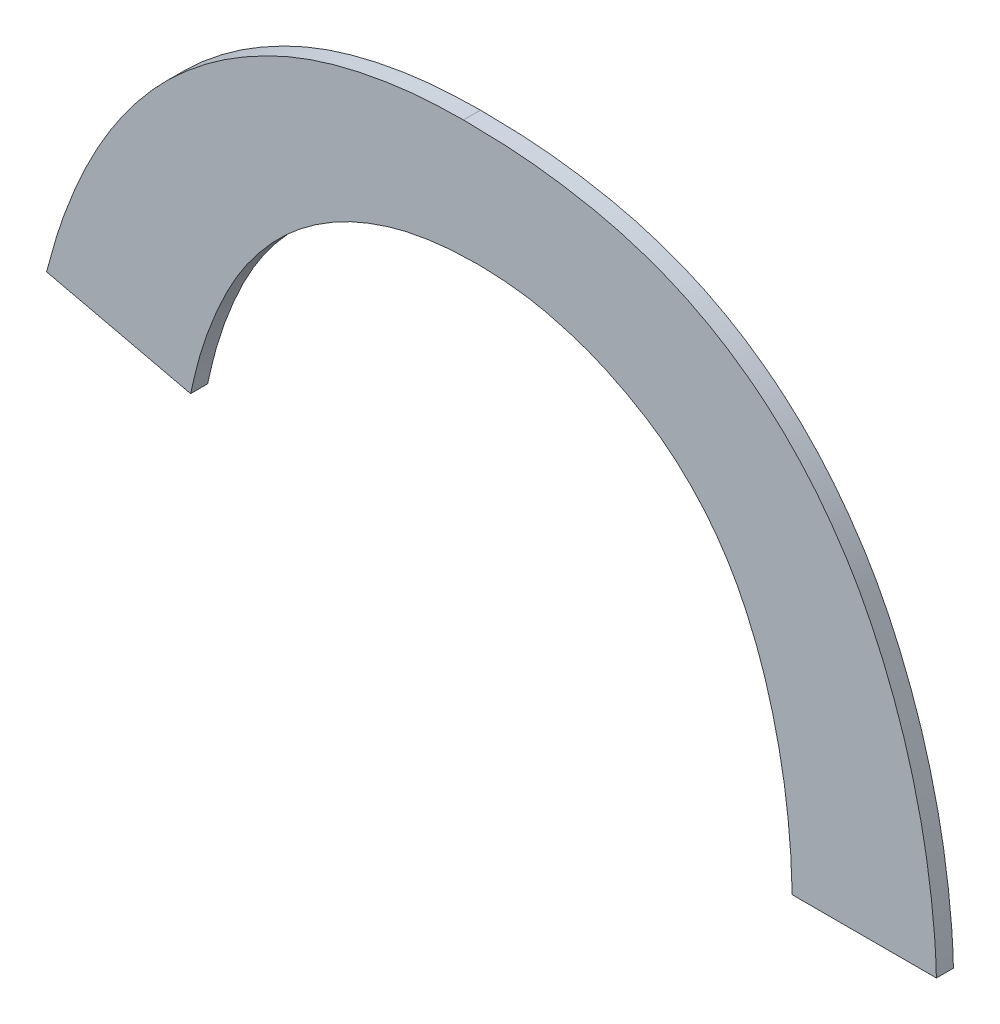
ISO-10303-21;
HEADER;
FILE_DESCRIPTION(('STEP AP214'),'2;1');
FILE_NAME('part.step','',(''),(''),'','','');
FILE_SCHEMA(('AUTOMOTIVE_DESIGN { 1 0 10303 214 1 1 1 1 }'));
ENDSEC;
DATA;
#1=APPLICATION_CONTEXT('core data for automotive mechanical design processes');
#2=APPLICATION_PROTOCOL_DEFINITION('international standard','automotive_design',2000,#1);
#3=PRODUCT_CONTEXT('',#1,'mechanical');
#4=PRODUCT('Part','Part','',(#3));
#5=PRODUCT_RELATED_PRODUCT_CATEGORY('part','',(#4));
#6=PRODUCT_DEFINITION_FORMATION('','',#4);
#7=PRODUCT_DEFINITION_CONTEXT('part definition',#1,'design');
#8=PRODUCT_DEFINITION('design','',#6,#7);
#9=PRODUCT_DEFINITION_SHAPE('','',#8);
#10=(LENGTH_UNIT() NAMED_UNIT(*) SI_UNIT(.MILLI.,.METRE.));
#11=(NAMED_UNIT(*) PLANE_ANGLE_UNIT() SI_UNIT($,.RADIAN.));
#12=(NAMED_UNIT(*) SI_UNIT($,.STERADIAN.) SOLID_ANGLE_UNIT());
#13=UNCERTAINTY_MEASURE_WITH_UNIT(LENGTH_MEASURE(1.E-05),#10,'distance_accuracy_value','');
#14=(GEOMETRIC_REPRESENTATION_CONTEXT(3) GLOBAL_UNCERTAINTY_ASSIGNED_CONTEXT((#13)) GLOBAL_UNIT_ASSIGNED_CONTEXT((#10,
#11,#12)) REPRESENTATION_CONTEXT('',''));
#15=CARTESIAN_POINT('',(0.,0.,0.));
#16=DIRECTION('',(0.,0.,1.));
#17=DIRECTION('',(1.,0.,0.));
#18=AXIS2_PLACEMENT_3D('',#15,#16,#17);
#19=CARTESIAN_POINT('',(-6.07885597286198,9.82122713151079,0.5));
#20=DIRECTION('',(0.,0.,-1.));
#21=DIRECTION('',(0.,1.,0.));
#22=AXIS2_PLACEMENT_3D('',#19,#20,#21);
#23=PLANE('',#22);
#24=DIRECTION('',(1.,0.,0.));
#25=VECTOR('',#24,1.);
#26=CARTESIAN_POINT('',(-6.07885597286198,0.5,0.500000000000177));
#27=LINE('',#26,#25);
#28=CARTESIAN_POINT('',(8.82933136932666,0.499999990289268,0.5));
#29=VERTEX_POINT('',#28);
#30=CARTESIAN_POINT('',(13.0640804060843,0.5,0.5000000000002));
#31=VERTEX_POINT('',#30);
#32=EDGE_CURVE('E11',#29,#31,#27,.T.);
#33=ORIENTED_EDGE('',*,*,#32,.F.);
#34=CARTESIAN_POINT('',(8.84615384615384,-0.240384615384616,0.5));
#35=CARTESIAN_POINT('',(8.83398126666469,0.367096685039156,0.5));
#36=CARTESIAN_POINT('',(8.81033020171972,1.54742002587159,0.5));
#37=CARTESIAN_POINT('',(8.61319931762913,3.25807996713799,0.5));
#38=CARTESIAN_POINT('',(8.27518621216392,4.84885033945239,0.5));
#39=CARTESIAN_POINT('',(7.88903106277403,6.09121694461355,0.5));
#40=CARTESIAN_POINT('',(7.4974970915339,7.00815389979569,0.5));
#41=CARTESIAN_POINT('',(7.18124696346013,7.65036739296747,0.5));
#42=CARTESIAN_POINT('',(6.82015347954806,8.2446232076384,0.5));
#43=CARTESIAN_POINT('',(6.42331831046708,8.79431946884205,0.5));
#44=CARTESIAN_POINT('',(5.98559874015225,9.29784674751303,0.5));
#45=CARTESIAN_POINT('',(5.51310107899629,9.75788136339965,0.5));
#46=CARTESIAN_POINT('',(5.00571768516569,10.1788495267714,0.5));
#47=CARTESIAN_POINT('',(4.45743709551845,10.5410450597504,0.5));
#48=CARTESIAN_POINT('',(3.88936317165982,10.8626431046413,0.5));
#49=CARTESIAN_POINT('',(3.30866458846087,11.1486142290802,0.5));
#50=CARTESIAN_POINT('',(2.7149757211834,11.3904759489302,0.5));
#51=CARTESIAN_POINT('',(2.10590128876737,11.5783590450257,0.5));
#52=CARTESIAN_POINT('',(1.48999432481215,11.7407161607179,0.5));
#53=CARTESIAN_POINT('',(0.860471249043183,11.8467754487439,0.5));
#54=CARTESIAN_POINT('',(0.217511576918454,11.9066319693991,0.5));
#55=CARTESIAN_POINT('',(-0.214219945096661,11.9175513210807,0.5));
#56=CARTESIAN_POINT('',(-0.432692307692314,11.9230769230769,0.5));
#57=B_SPLINE_CURVE_WITH_KNOTS('',3,(#34,#35,#36,#37,#38,#39,#40,#41,#42,#43,#44,#45,#46,#47,#48,
#49,#50,#51,#52,#53,#54,#55,#56),.UNSPECIFIED.,.F.,.F.,(4,1,1,1,1,1,1,1,1,1,1,1,1,1,1,1,1,1,1,1,
4),(0.,0.105339479752047,0.204672385101815,0.298093856741324,0.387091939736616,
0.429746197456861,0.470920230702653,0.511139219083011,0.550194928589181,0.588369145720547,
0.626696410607052,0.664463729634978,0.702525532038284,0.740490486934576,0.777626103886622,
0.814722695746582,0.851531839400538,0.888102467490314,0.925114363824572,0.962105055977007,1.),.UNSPECIFIED.);
#58=CARTESIAN_POINT('',(-0.432692307692314,11.9230769230769,0.5));
#59=VERTEX_POINT('',#58);
#60=EDGE_CURVE('E99',#29,#59,#57,.T.);
#61=ORIENTED_EDGE('',*,*,#60,.T.);
#62=CARTESIAN_POINT('',(-0.432692307692314,11.9230769230769,0.5));
#63=CARTESIAN_POINT('',(-0.69340945517444,11.917609620185,0.5));
#64=CARTESIAN_POINT('',(-1.20841800813543,11.9068097637959,0.5));
#65=CARTESIAN_POINT('',(-1.96348080711089,11.8122628871029,0.5));
#66=CARTESIAN_POINT('',(-2.69137055894695,11.6729707242835,0.5));
#67=CARTESIAN_POINT('',(-3.38317763830804,11.4579000324008,0.5));
#68=CARTESIAN_POINT('',(-4.04854246600951,11.195012931142,0.5));
#69=CARTESIAN_POINT('',(-4.68228311333952,10.8684182238982,0.5));
#70=CARTESIAN_POINT('',(-5.28530649203685,10.4815121263121,0.5));
#71=CARTESIAN_POINT('',(-5.85761881794384,10.0381635359939,0.5));
#72=CARTESIAN_POINT('',(-6.38657846611972,9.53039775365507,0.5));
#73=CARTESIAN_POINT('',(-6.8747926311862,8.96890198563499,0.5));
#74=CARTESIAN_POINT('',(-7.32252220640648,8.35359237850827,0.5));
#75=CARTESIAN_POINT('',(-7.72027026974522,7.67703510366605,0.5));
#76=CARTESIAN_POINT('',(-8.06459660374274,6.93935100127638,0.5));
#77=CARTESIAN_POINT('',(-8.3807108448953,6.15104671399827,0.5));
#78=CARTESIAN_POINT('',(-8.64496259454517,5.30279678468661,0.5));
#79=CARTESIAN_POINT('',(-8.77812671554661,4.71257404165091,0.5));
#80=CARTESIAN_POINT('',(-8.84615384615385,4.41105769230769,0.5));
#81=B_SPLINE_CURVE_WITH_KNOTS('',3,(#62,#63,#64,#65,#66,#67,#68,#69,#70,#71,#72,#73,#74,#75,#76,
#77,#78,#79,#80),.UNSPECIFIED.,.F.,.F.,(4,1,1,1,1,1,1,1,1,1,1,1,1,1,1,1,4),(0.,
0.063330028262411,0.125099198611933,0.184671346484425,0.24318797106206,0.300860238035557,
0.358337001748363,0.416132403728541,0.474752201982371,0.533973265293694,0.594009016639666,
0.65535280490799,0.718636043338921,0.784394707053025,0.853005055958516,0.924907368578614,1.),.UNSPECIFIED.);
#82=CARTESIAN_POINT('',(-8.84615384615385,4.41105769230769,0.5));
#83=VERTEX_POINT('',#82);
#84=EDGE_CURVE('E141',#59,#83,#81,.T.);
#85=ORIENTED_EDGE('',*,*,#84,.T.);
#86=DIRECTION('',(-0.973922781385371,0.226879738845456,0.));
#87=VECTOR('',#86,1.);
#88=CARTESIAN_POINT('',(-8.84615384615385,4.41105769230769,0.5));
#89=LINE('',#88,#87);
#90=CARTESIAN_POINT('',(-13.0769230769231,5.39663461538462,0.5));
#91=VERTEX_POINT('',#90);
#92=EDGE_CURVE('E180',#83,#91,#89,.T.);
#93=ORIENTED_EDGE('',*,*,#92,.T.);
#94=CARTESIAN_POINT('',(-13.0769230769231,5.39663461538462,0.5));
#95=CARTESIAN_POINT('',(-12.970933550222,5.79317541747696,0.5));
#96=CARTESIAN_POINT('',(-12.7636048811642,6.56885844280794,0.5));
#97=CARTESIAN_POINT('',(-12.3536363027421,7.6789037308633,0.5));
#98=CARTESIAN_POINT('',(-11.8936991790025,8.72079664380797,0.5));
#99=CARTESIAN_POINT('',(-11.3717302097082,9.69104018812744,0.5));
#100=CARTESIAN_POINT('',(-10.7860925573578,10.5854157042037,0.5));
#101=CARTESIAN_POINT('',(-10.1393445084831,11.4084138755403,0.5));
#102=CARTESIAN_POINT('',(-9.43158165577591,12.1613433198885,0.5));
#103=CARTESIAN_POINT('',(-8.65737286536125,12.8349149096524,0.5));
#104=CARTESIAN_POINT('',(-7.83687577523735,13.4373777714888,0.5));
#105=CARTESIAN_POINT('',(-6.96434737288175,13.9537483587375,0.5));
#106=CARTESIAN_POINT('',(-6.05526774122526,14.404024836117,0.5));
#107=CARTESIAN_POINT('',(-5.09476799679627,14.7649458645215,0.5));
#108=CARTESIAN_POINT('',(-4.08990039185508,15.0387021708602,0.5));
#109=CARTESIAN_POINT('',(-3.04316934007499,15.2375962266347,0.5));
#110=CARTESIAN_POINT('',(-1.95203173899559,15.3602587928257,0.5));
#111=CARTESIAN_POINT('',(-1.20825546301646,15.3763946950504,0.5));
#112=CARTESIAN_POINT('',(-0.829326923076929,15.3846153846154,0.5));
#113=B_SPLINE_CURVE_WITH_KNOTS('',3,(#94,#95,#96,#97,#98,#99,#100,#101,#102,#103,#104,#105,#106,
#107,#108,#109,#110,#111,#112),.UNSPECIFIED.,.F.,.F.,(4,1,1,1,1,1,1,1,1,1,1,1,1,1,1,1,4),(0.,
0.0715854855035118,0.140030094437089,0.206217888479769,0.270182895098252,0.332033964703583,
0.392518874053736,0.452602518770073,0.512051453899582,0.571336786204292,0.62996209992467,
0.688738304888729,0.748138926346642,0.808684401375538,0.870243431839906,0.933893472394314,1.),.UNSPECIFIED.);
#114=CARTESIAN_POINT('',(-0.829326923076929,15.3846153846154,0.5));
#115=VERTEX_POINT('',#114);
#116=EDGE_CURVE('E192',#91,#115,#113,.T.);
#117=ORIENTED_EDGE('',*,*,#116,.T.);
#118=CARTESIAN_POINT('',(-0.829326923076929,15.3846153846154,0.5));
#119=CARTESIAN_POINT('',(-0.440557179861981,15.3788948124046,0.5));
#120=CARTESIAN_POINT('',(0.320039755541345,15.3677029700139,0.5));
#121=CARTESIAN_POINT('',(1.43454950269257,15.2788306725971,0.5));
#122=CARTESIAN_POINT('',(2.49309922187384,15.1194028305253,0.5));
#123=CARTESIAN_POINT('',(3.4994615994657,14.9154707858665,0.5));
#124=CARTESIAN_POINT('',(4.44649961228966,14.6354972252978,0.5));
#125=CARTESIAN_POINT('',(5.34106739781333,14.3015032194153,0.5));
#126=CARTESIAN_POINT('',(6.17544511372733,13.8971163370446,0.5));
#127=CARTESIAN_POINT('',(6.95846262174525,13.4383380328501,0.5));
#128=CARTESIAN_POINT('',(7.68644799922999,12.916857407003,0.5));
#129=CARTESIAN_POINT('',(8.37604620842589,12.3470747448797,0.5));
#130=CARTESIAN_POINT('',(9.01049237199333,11.7132172211276,0.5));
#131=CARTESIAN_POINT('',(9.60565645917213,11.0302740240603,0.5));
#132=CARTESIAN_POINT('',(10.1485738611674,10.2892298754838,0.5));
#133=CARTESIAN_POINT('',(10.6592191002259,9.50015388064046,0.5));
#134=CARTESIAN_POINT('',(11.1126677481645,8.6491420802736,0.5));
#135=CARTESIAN_POINT('',(11.5257242975994,7.75197238526569,0.5));
#136=CARTESIAN_POINT('',(11.8882728577656,6.81733097369576,0.5));
#137=CARTESIAN_POINT('',(12.2090015214765,5.863679605221,0.5));
#138=CARTESIAN_POINT('',(12.4712147377354,4.88911802384456,0.5));
#139=CARTESIAN_POINT('',(12.696963396209,3.90184699656092,0.5));
#140=CARTESIAN_POINT('',(12.8609588580428,2.89355931617879,0.5));
#141=CARTESIAN_POINT('',(12.9911661773081,1.87182022598771,0.5));
#142=CARTESIAN_POINT('',(13.0627567792529,0.830365581435879,0.5));
#143=CARTESIAN_POINT('',(13.0721773471634,0.130307372457455,0.5));
#144=CARTESIAN_POINT('',(13.0769230769231,-0.22235576923077,0.5));
#145=B_SPLINE_CURVE_WITH_KNOTS('',3,(#118,#119,#120,#121,#122,#123,#124,#125,#126,#127,#128,
#129,#130,#131,#132,#133,#134,#135,#136,#137,#138,#139,#140,#141,#142,#143,#144),.UNSPECIFIED.,
.F.,.F.,(4,1,1,1,1,1,1,1,1,1,1,1,1,1,1,1,1,1,1,1,1,1,1,1,4),(0.,0.0491950405787718,
0.0962461656399226,0.141346107073708,0.184600113279332,0.226072499395465,0.266186184566012,
0.305302243977314,0.343256820074549,0.380888329213705,0.418506174662803,0.45632845717066,
0.494245766425286,0.533031865834939,0.572480826920874,0.613085716749447,0.65494061502632,
0.697402181845138,0.739888712486229,0.782198668270683,0.825064658023017,0.867989822382011,
0.911412125537456,0.955372742262342,1.),.UNSPECIFIED.);
#146=EDGE_CURVE('E94',#115,#31,#145,.T.);
#147=ORIENTED_EDGE('',*,*,#146,.T.);
#148=EDGE_LOOP('',(#33,#61,#85,#93,#117,#147));
#149=FACE_BOUND('',#148,.T.);
#150=ADVANCED_FACE('F39',(#149),#23,.T.);
#151=CARTESIAN_POINT('',(-6.07885597286198,9.82122713151079,1.));
#152=DIRECTION('',(0.,0.,-1.));
#153=DIRECTION('',(0.,1.,0.));
#154=AXIS2_PLACEMENT_3D('',#151,#152,#153);
#155=PLANE('',#154);
#156=CARTESIAN_POINT('',(8.84615384615384,-0.240384615384616,1.));
#157=CARTESIAN_POINT('',(8.83398126666469,0.367096685039156,1.));
#158=CARTESIAN_POINT('',(8.81033020171972,1.54742002587159,1.));
#159=CARTESIAN_POINT('',(8.61319931762913,3.25807996713799,1.));
#160=CARTESIAN_POINT('',(8.27518621216392,4.84885033945239,1.));
#161=CARTESIAN_POINT('',(7.88903106277403,6.09121694461355,1.));
#162=CARTESIAN_POINT('',(7.4974970915339,7.00815389979569,1.));
#163=CARTESIAN_POINT('',(7.18124696346013,7.65036739296747,1.));
#164=CARTESIAN_POINT('',(6.82015347954806,8.2446232076384,1.));
#165=CARTESIAN_POINT('',(6.42331831046708,8.79431946884205,1.));
#166=CARTESIAN_POINT('',(5.98559874015225,9.29784674751303,1.));
#167=CARTESIAN_POINT('',(5.51310107899629,9.75788136339965,1.));
#168=CARTESIAN_POINT('',(5.00571768516569,10.1788495267714,1.));
#169=CARTESIAN_POINT('',(4.45743709551845,10.5410450597504,1.));
#170=CARTESIAN_POINT('',(3.88936317165982,10.8626431046413,1.));
#171=CARTESIAN_POINT('',(3.30866458846087,11.1486142290802,1.));
#172=CARTESIAN_POINT('',(2.7149757211834,11.3904759489302,1.));
#173=CARTESIAN_POINT('',(2.10590128876737,11.5783590450257,1.));
#174=CARTESIAN_POINT('',(1.48999432481215,11.7407161607179,1.));
#175=CARTESIAN_POINT('',(0.860471249043183,11.8467754487439,1.));
#176=CARTESIAN_POINT('',(0.217511576918454,11.9066319693991,1.));
#177=CARTESIAN_POINT('',(-0.214219945096661,11.9175513210807,1.));
#178=CARTESIAN_POINT('',(-0.432692307692314,11.9230769230769,1.));
#179=B_SPLINE_CURVE_WITH_KNOTS('',3,(#156,#157,#158,#159,#160,#161,#162,#163,#164,#165,#166,
#167,#168,#169,#170,#171,#172,#173,#174,#175,#176,#177,#178),.UNSPECIFIED.,.F.,.F.,(4,1,1,1,1,1,
1,1,1,1,1,1,1,1,1,1,1,1,1,1,4),(0.,0.105339479752047,0.204672385101815,0.298093856741324,
0.387091939736616,0.429746197456861,0.470920230702653,0.511139219083011,0.550194928589181,
0.588369145720547,0.626696410607052,0.664463729634978,0.702525532038284,0.740490486934576,
0.777626103886622,0.814722695746582,0.851531839400538,0.888102467490314,0.925114363824572,
0.962105055977007,1.),.UNSPECIFIED.);
#180=CARTESIAN_POINT('',(8.82933136932666,0.5,1.));
#181=VERTEX_POINT('',#180);
#182=CARTESIAN_POINT('',(-0.432692307692314,11.9230769230769,1.));
#183=VERTEX_POINT('',#182);
#184=EDGE_CURVE('E47',#181,#183,#179,.T.);
#185=ORIENTED_EDGE('',*,*,#184,.F.);
#186=DIRECTION('',(1.,0.,0.));
#187=VECTOR('',#186,1.);
#188=CARTESIAN_POINT('',(-17.,0.5,1.));
#189=LINE('',#188,#187);
#190=CARTESIAN_POINT('',(13.0640804060843,0.5,1.));
#191=VERTEX_POINT('',#190);
#192=EDGE_CURVE('E43',#181,#191,#189,.T.);
#193=ORIENTED_EDGE('',*,*,#192,.T.);
#194=CARTESIAN_POINT('',(-0.829326923076929,15.3846153846154,1.));
#195=CARTESIAN_POINT('',(-0.440557179861981,15.3788948124046,1.));
#196=CARTESIAN_POINT('',(0.320039755541345,15.3677029700139,1.));
#197=CARTESIAN_POINT('',(1.43454950269257,15.2788306725971,1.));
#198=CARTESIAN_POINT('',(2.49309922187384,15.1194028305253,1.));
#199=CARTESIAN_POINT('',(3.4994615994657,14.9154707858665,1.));
#200=CARTESIAN_POINT('',(4.44649961228966,14.6354972252978,1.));
#201=CARTESIAN_POINT('',(5.34106739781333,14.3015032194153,1.));
#202=CARTESIAN_POINT('',(6.17544511372733,13.8971163370446,1.));
#203=CARTESIAN_POINT('',(6.95846262174525,13.4383380328501,1.));
#204=CARTESIAN_POINT('',(7.68644799922999,12.916857407003,1.));
#205=CARTESIAN_POINT('',(8.37604620842589,12.3470747448797,1.));
#206=CARTESIAN_POINT('',(9.01049237199333,11.7132172211276,1.));
#207=CARTESIAN_POINT('',(9.60565645917213,11.0302740240603,1.));
#208=CARTESIAN_POINT('',(10.1485738611674,10.2892298754838,1.));
#209=CARTESIAN_POINT('',(10.6592191002259,9.50015388064046,1.));
#210=CARTESIAN_POINT('',(11.1126677481645,8.6491420802736,1.));
#211=CARTESIAN_POINT('',(11.5257242975994,7.75197238526569,1.));
#212=CARTESIAN_POINT('',(11.8882728577656,6.81733097369576,1.));
#213=CARTESIAN_POINT('',(12.2090015214765,5.863679605221,1.));
#214=CARTESIAN_POINT('',(12.4712147377354,4.88911802384456,1.));
#215=CARTESIAN_POINT('',(12.696963396209,3.90184699656092,1.));
#216=CARTESIAN_POINT('',(12.8609588580428,2.89355931617879,1.));
#217=CARTESIAN_POINT('',(12.9911661773081,1.87182022598771,1.));
#218=CARTESIAN_POINT('',(13.0627567792529,0.830365581435879,1.));
#219=CARTESIAN_POINT('',(13.0721773471634,0.130307372457455,1.));
#220=CARTESIAN_POINT('',(13.0769230769231,-0.22235576923077,1.));
#221=B_SPLINE_CURVE_WITH_KNOTS('',3,(#194,#195,#196,#197,#198,#199,#200,#201,#202,#203,#204,
#205,#206,#207,#208,#209,#210,#211,#212,#213,#214,#215,#216,#217,#218,#219,#220),.UNSPECIFIED.,
.F.,.F.,(4,1,1,1,1,1,1,1,1,1,1,1,1,1,1,1,1,1,1,1,1,1,1,1,4),(0.,0.0491950405787718,
0.0962461656399226,0.141346107073708,0.184600113279332,0.226072499395465,0.266186184566012,
0.305302243977314,0.343256820074549,0.380888329213705,0.418506174662803,0.45632845717066,
0.494245766425286,0.533031865834939,0.572480826920874,0.613085716749447,0.65494061502632,
0.697402181845138,0.739888712486229,0.782198668270683,0.825064658023017,0.867989822382011,
0.911412125537456,0.955372742262342,1.),.UNSPECIFIED.);
#222=CARTESIAN_POINT('',(-0.829326923076929,15.3846153846154,1.));
#223=VERTEX_POINT('',#222);
#224=EDGE_CURVE('E115',#223,#191,#221,.T.);
#225=ORIENTED_EDGE('',*,*,#224,.F.);
#226=CARTESIAN_POINT('',(-13.0769230769231,5.39663461538462,1.));
#227=CARTESIAN_POINT('',(-12.970933550222,5.79317541747696,1.));
#228=CARTESIAN_POINT('',(-12.7636048811642,6.56885844280794,1.));
#229=CARTESIAN_POINT('',(-12.3536363027421,7.6789037308633,1.));
#230=CARTESIAN_POINT('',(-11.8936991790025,8.72079664380797,1.));
#231=CARTESIAN_POINT('',(-11.3717302097082,9.69104018812744,1.));
#232=CARTESIAN_POINT('',(-10.7860925573578,10.5854157042037,1.));
#233=CARTESIAN_POINT('',(-10.1393445084831,11.4084138755403,1.));
#234=CARTESIAN_POINT('',(-9.43158165577591,12.1613433198885,1.));
#235=CARTESIAN_POINT('',(-8.65737286536125,12.8349149096524,1.));
#236=CARTESIAN_POINT('',(-7.83687577523735,13.4373777714888,1.));
#237=CARTESIAN_POINT('',(-6.96434737288175,13.9537483587375,1.));
#238=CARTESIAN_POINT('',(-6.05526774122526,14.404024836117,1.));
#239=CARTESIAN_POINT('',(-5.09476799679627,14.7649458645215,1.));
#240=CARTESIAN_POINT('',(-4.08990039185508,15.0387021708602,1.));
#241=CARTESIAN_POINT('',(-3.04316934007499,15.2375962266347,1.));
#242=CARTESIAN_POINT('',(-1.95203173899559,15.3602587928257,1.));
#243=CARTESIAN_POINT('',(-1.20825546301646,15.3763946950504,1.));
#244=CARTESIAN_POINT('',(-0.829326923076929,15.3846153846154,1.));
#245=B_SPLINE_CURVE_WITH_KNOTS('',3,(#226,#227,#228,#229,#230,#231,#232,#233,#234,#235,#236,
#237,#238,#239,#240,#241,#242,#243,#244),.UNSPECIFIED.,.F.,.F.,(4,1,1,1,1,1,1,1,1,1,1,1,1,1,1,1,
4),(0.,0.0715854855035118,0.140030094437089,0.206217888479769,0.270182895098252,
0.332033964703583,0.392518874053736,0.452602518770073,0.512051453899582,0.571336786204292,
0.62996209992467,0.688738304888729,0.748138926346642,0.808684401375538,0.870243431839906,
0.933893472394314,1.),.UNSPECIFIED.);
#246=CARTESIAN_POINT('',(-13.0769230769231,5.39663461538462,1.));
#247=VERTEX_POINT('',#246);
#248=EDGE_CURVE('E118',#247,#223,#245,.T.);
#249=ORIENTED_EDGE('',*,*,#248,.F.);
#250=DIRECTION('',(-0.973922781385371,0.226879738845456,0.));
#251=VECTOR('',#250,1.);
#252=CARTESIAN_POINT('',(-8.84615384615385,4.41105769230769,1.));
#253=LINE('',#252,#251);
#254=CARTESIAN_POINT('',(-8.84615384615385,4.41105769230769,1.));
#255=VERTEX_POINT('',#254);
#256=EDGE_CURVE('E126',#255,#247,#253,.T.);
#257=ORIENTED_EDGE('',*,*,#256,.F.);
#258=CARTESIAN_POINT('',(-0.432692307692314,11.9230769230769,1.));
#259=CARTESIAN_POINT('',(-0.69340945517444,11.917609620185,1.));
#260=CARTESIAN_POINT('',(-1.20841800813543,11.9068097637959,1.));
#261=CARTESIAN_POINT('',(-1.96348080711089,11.8122628871029,1.));
#262=CARTESIAN_POINT('',(-2.69137055894695,11.6729707242835,1.));
#263=CARTESIAN_POINT('',(-3.38317763830804,11.4579000324008,1.));
#264=CARTESIAN_POINT('',(-4.04854246600951,11.195012931142,1.));
#265=CARTESIAN_POINT('',(-4.68228311333952,10.8684182238982,1.));
#266=CARTESIAN_POINT('',(-5.28530649203685,10.4815121263121,1.));
#267=CARTESIAN_POINT('',(-5.85761881794384,10.0381635359939,1.));
#268=CARTESIAN_POINT('',(-6.38657846611972,9.53039775365507,1.));
#269=CARTESIAN_POINT('',(-6.8747926311862,8.96890198563499,1.));
#270=CARTESIAN_POINT('',(-7.32252220640648,8.35359237850827,1.));
#271=CARTESIAN_POINT('',(-7.72027026974522,7.67703510366605,1.));
#272=CARTESIAN_POINT('',(-8.06459660374274,6.93935100127638,1.));
#273=CARTESIAN_POINT('',(-8.3807108448953,6.15104671399827,1.));
#274=CARTESIAN_POINT('',(-8.64496259454517,5.30279678468661,1.));
#275=CARTESIAN_POINT('',(-8.77812671554661,4.71257404165091,1.));
#276=CARTESIAN_POINT('',(-8.84615384615385,4.41105769230769,1.));
#277=B_SPLINE_CURVE_WITH_KNOTS('',3,(#258,#259,#260,#261,#262,#263,#264,#265,#266,#267,#268,
#269,#270,#271,#272,#273,#274,#275,#276),.UNSPECIFIED.,.F.,.F.,(4,1,1,1,1,1,1,1,1,1,1,1,1,1,1,1,
4),(0.,0.063330028262411,0.125099198611933,0.184671346484425,0.24318797106206,0.300860238035557,
0.358337001748363,0.416132403728541,0.474752201982371,0.533973265293694,0.594009016639666,
0.65535280490799,0.718636043338921,0.784394707053025,0.853005055958516,0.924907368578614,1.),.UNSPECIFIED.);
#278=EDGE_CURVE('E91',#183,#255,#277,.T.);
#279=ORIENTED_EDGE('',*,*,#278,.F.);
#280=EDGE_LOOP('',(#185,#193,#225,#249,#257,#279));
#281=FACE_BOUND('',#280,.T.);
#282=ADVANCED_FACE('F41',(#281),#155,.F.);
#283=DIRECTION('',(0.,0.,1.));
#284=VECTOR('',#283,1.);
#285=SURFACE_OF_LINEAR_EXTRUSION('',#81,#284);
#286=ORIENTED_EDGE('',*,*,#278,.T.);
#287=DIRECTION('',(0.,0.,1.));
#288=VECTOR('',#287,1.);
#289=CARTESIAN_POINT('',(-8.84615384615385,4.41105769230769,0.5));
#290=LINE('',#289,#288);
#291=EDGE_CURVE('E130',#83,#255,#290,.T.);
#292=ORIENTED_EDGE('',*,*,#291,.F.);
#293=ORIENTED_EDGE('',*,*,#84,.F.);
#294=DIRECTION('',(0.,0.,1.));
#295=VECTOR('',#294,1.);
#296=CARTESIAN_POINT('',(-0.432692307692314,11.9230769230769,0.5));
#297=LINE('',#296,#295);
#298=EDGE_CURVE('E109',#59,#183,#297,.T.);
#299=ORIENTED_EDGE('',*,*,#298,.T.);
#300=EDGE_LOOP('',(#286,#292,#293,#299));
#301=FACE_BOUND('',#300,.T.);
#302=ADVANCED_FACE('F164',(#301),#285,.F.);
#303=CARTESIAN_POINT('',(-8.84615384615385,4.41105769230769,0.5));
#304=DIRECTION('',(0.226879738845456,0.973922781385371,0.));
#305=DIRECTION('',(-0.973922781385371,0.226879738845456,0.));
#306=AXIS2_PLACEMENT_3D('',#303,#304,#305);
#307=PLANE('',#306);
#308=ORIENTED_EDGE('',*,*,#256,.T.);
#309=DIRECTION('',(0.,0.,1.));
#310=VECTOR('',#309,1.);
#311=CARTESIAN_POINT('',(-13.0769230769231,5.39663461538462,0.5));
#312=LINE('',#311,#310);
#313=EDGE_CURVE('E116',#91,#247,#312,.T.);
#314=ORIENTED_EDGE('',*,*,#313,.F.);
#315=ORIENTED_EDGE('',*,*,#92,.F.);
#316=ORIENTED_EDGE('',*,*,#291,.T.);
#317=EDGE_LOOP('',(#308,#314,#315,#316));
#318=FACE_BOUND('',#317,.T.);
#319=ADVANCED_FACE('F184',(#318),#307,.F.);
#320=DIRECTION('',(0.,0.,1.));
#321=VECTOR('',#320,1.);
#322=SURFACE_OF_LINEAR_EXTRUSION('',#113,#321);
#323=ORIENTED_EDGE('',*,*,#248,.T.);
#324=DIRECTION('',(0.,0.,1.));
#325=VECTOR('',#324,1.);
#326=CARTESIAN_POINT('',(-0.829326923076929,15.3846153846154,0.5));
#327=LINE('',#326,#325);
#328=EDGE_CURVE('E101',#115,#223,#327,.T.);
#329=ORIENTED_EDGE('',*,*,#328,.F.);
#330=ORIENTED_EDGE('',*,*,#116,.F.);
#331=ORIENTED_EDGE('',*,*,#313,.T.);
#332=EDGE_LOOP('',(#323,#329,#330,#331));
#333=FACE_BOUND('',#332,.T.);
#334=ADVANCED_FACE('F190',(#333),#322,.F.);
#335=DIRECTION('',(0.,0.,1.));
#336=VECTOR('',#335,1.);
#337=SURFACE_OF_LINEAR_EXTRUSION('',#145,#336);
#338=ORIENTED_EDGE('',*,*,#224,.T.);
#339=DIRECTION('',(0.,0.,1.));
#340=VECTOR('',#339,1.);
#341=CARTESIAN_POINT('',(13.0640804058272,0.500000000000001,0.5));
#342=LINE('',#341,#340);
#343=EDGE_CURVE('E54',#191,#31,#342,.F.);
#344=ORIENTED_EDGE('',*,*,#343,.T.);
#345=ORIENTED_EDGE('',*,*,#146,.F.);
#346=ORIENTED_EDGE('',*,*,#328,.T.);
#347=EDGE_LOOP('',(#338,#344,#345,#346));
#348=FACE_BOUND('',#347,.T.);
#349=ADVANCED_FACE('F154',(#348),#337,.F.);
#350=DIRECTION('',(0.,0.,1.));
#351=VECTOR('',#350,1.);
#352=SURFACE_OF_LINEAR_EXTRUSION('',#57,#351);
#353=ORIENTED_EDGE('',*,*,#60,.F.);
#354=DIRECTION('',(0.,0.,1.));
#355=VECTOR('',#354,1.);
#356=CARTESIAN_POINT('',(8.82933136905388,0.5,0.5));
#357=LINE('',#356,#355);
#358=EDGE_CURVE('E88',#29,#181,#357,.T.);
#359=ORIENTED_EDGE('',*,*,#358,.T.);
#360=ORIENTED_EDGE('',*,*,#184,.T.);
#361=ORIENTED_EDGE('',*,*,#298,.F.);
#362=EDGE_LOOP('',(#353,#359,#360,#361));
#363=FACE_BOUND('',#362,.T.);
#364=ADVANCED_FACE('F100',(#363),#352,.F.);
#365=CARTESIAN_POINT('',(-17.,0.5,1.));
#366=DIRECTION('',(0.,1.,0.));
#367=DIRECTION('',(0.,0.,1.));
#368=AXIS2_PLACEMENT_3D('',#365,#366,#367);
#369=PLANE('',#368);
#370=ORIENTED_EDGE('',*,*,#192,.F.);
#371=ORIENTED_EDGE('',*,*,#358,.F.);
#372=ORIENTED_EDGE('',*,*,#32,.T.);
#373=ORIENTED_EDGE('',*,*,#343,.F.);
#374=EDGE_LOOP('',(#370,#371,#372,#373));
#375=FACE_BOUND('',#374,.T.);
#376=ADVANCED_FACE('F86',(#375),#369,.F.);
#377=CLOSED_SHELL('',(#150,#282,#302,#319,#334,#349,#364,#376));
#378=MANIFOLD_SOLID_BREP('B2',#377);
#379=ADVANCED_BREP_SHAPE_REPRESENTATION('',(#18,#378),#14);
#380=SHAPE_DEFINITION_REPRESENTATION(#9,#379);
ENDSEC;
END-ISO-10303-21;
